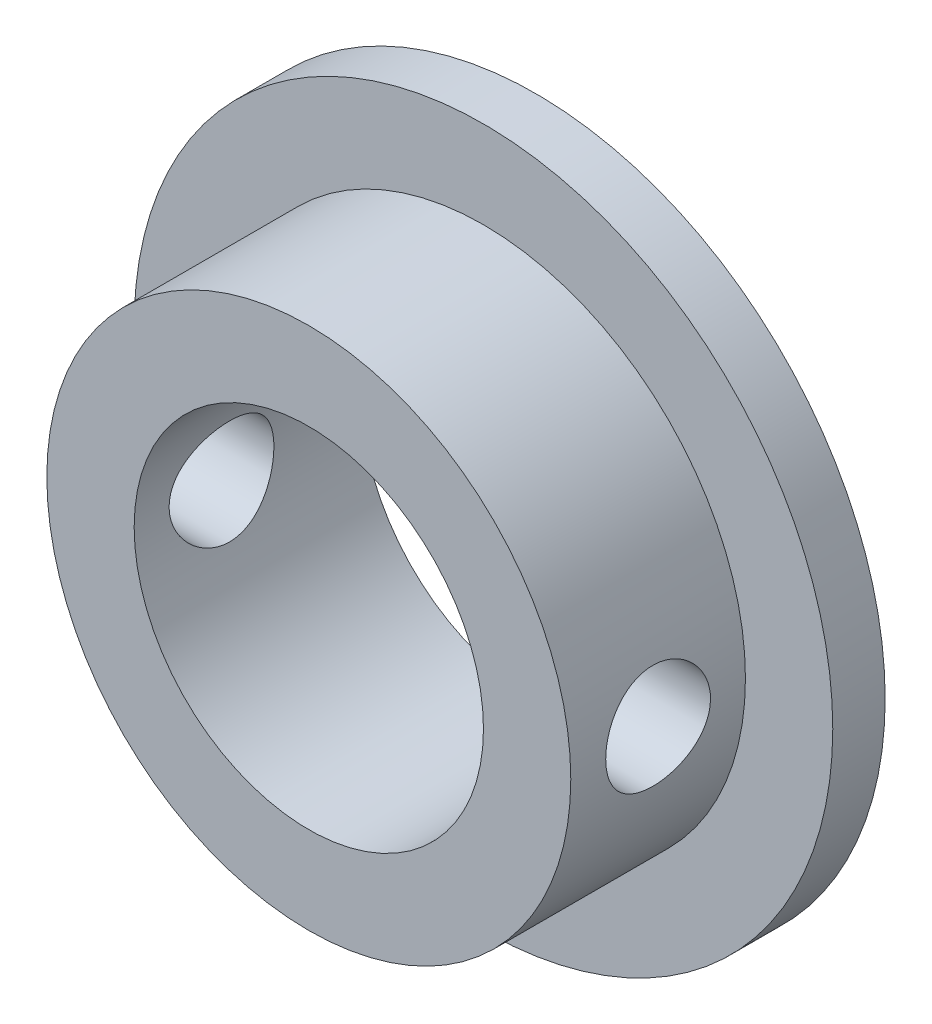
ISO-10303-21;
HEADER;
FILE_DESCRIPTION(('STEP AP214'),'2;1');
FILE_NAME('part.step','',(''),(''),'','','');
FILE_SCHEMA(('AUTOMOTIVE_DESIGN { 1 0 10303 214 1 1 1 1 }'));
ENDSEC;
DATA;
#1=APPLICATION_CONTEXT('core data for automotive mechanical design processes');
#2=APPLICATION_PROTOCOL_DEFINITION('international standard','automotive_design',2000,#1);
#3=PRODUCT_CONTEXT('',#1,'mechanical');
#4=PRODUCT('Part','Part','',(#3));
#5=PRODUCT_RELATED_PRODUCT_CATEGORY('part','',(#4));
#6=PRODUCT_DEFINITION_FORMATION('','',#4);
#7=PRODUCT_DEFINITION_CONTEXT('part definition',#1,'design');
#8=PRODUCT_DEFINITION('design','',#6,#7);
#9=PRODUCT_DEFINITION_SHAPE('','',#8);
#10=(LENGTH_UNIT() NAMED_UNIT(*) SI_UNIT(.MILLI.,.METRE.));
#11=(NAMED_UNIT(*) PLANE_ANGLE_UNIT() SI_UNIT($,.RADIAN.));
#12=(NAMED_UNIT(*) SI_UNIT($,.STERADIAN.) SOLID_ANGLE_UNIT());
#13=UNCERTAINTY_MEASURE_WITH_UNIT(LENGTH_MEASURE(1.E-05),#10,'distance_accuracy_value','');
#14=(GEOMETRIC_REPRESENTATION_CONTEXT(3) GLOBAL_UNCERTAINTY_ASSIGNED_CONTEXT((#13)) GLOBAL_UNIT_ASSIGNED_CONTEXT((#10,
#11,#12)) REPRESENTATION_CONTEXT('',''));
#15=CARTESIAN_POINT('',(0.,0.,0.));
#16=DIRECTION('',(0.,0.,1.));
#17=DIRECTION('',(1.,0.,0.));
#18=AXIS2_PLACEMENT_3D('',#15,#16,#17);
#19=CARTESIAN_POINT('',(0.,0.,1.5));
#20=DIRECTION('',(0.,0.,-1.));
#21=DIRECTION('',(-1.,0.,0.));
#22=AXIS2_PLACEMENT_3D('',#19,#20,#21);
#23=CYLINDRICAL_SURFACE('',#22,10.);
#24=CARTESIAN_POINT('',(0.,0.,1.5));
#25=DIRECTION('',(0.,0.,1.));
#26=DIRECTION('',(1.,0.,0.));
#27=AXIS2_PLACEMENT_3D('',#24,#25,#26);
#28=CIRCLE('',#27,10.);
#29=CARTESIAN_POINT('',(10.,0.,1.5));
#30=VERTEX_POINT('',#29);
#31=EDGE_CURVE('E52',#30,#30,#28,.T.);
#32=ORIENTED_EDGE('',*,*,#31,.F.);
#33=EDGE_LOOP('',(#32));
#34=FACE_BOUND('',#33,.T.);
#35=CARTESIAN_POINT('',(0.,0.,0.));
#36=DIRECTION('',(0.,0.,1.));
#37=DIRECTION('',(1.,0.,0.));
#38=AXIS2_PLACEMENT_3D('',#35,#36,#37);
#39=CIRCLE('',#38,10.);
#40=CARTESIAN_POINT('',(10.,0.,0.));
#41=VERTEX_POINT('',#40);
#42=EDGE_CURVE('E60',#41,#41,#39,.T.);
#43=ORIENTED_EDGE('',*,*,#42,.T.);
#44=EDGE_LOOP('',(#43));
#45=FACE_BOUND('',#44,.T.);
#46=ADVANCED_FACE('F39',(#34,#45),#23,.T.);
#47=CARTESIAN_POINT('',(0.,0.,1.5));
#48=DIRECTION('',(0.,0.,1.));
#49=DIRECTION('',(1.,0.,0.));
#50=AXIS2_PLACEMENT_3D('',#47,#48,#49);
#51=PLANE('',#50);
#52=CARTESIAN_POINT('',(0.,0.,1.5));
#53=DIRECTION('',(0.,0.,1.));
#54=DIRECTION('',(1.,0.,0.));
#55=AXIS2_PLACEMENT_3D('',#52,#53,#54);
#56=CIRCLE('',#55,7.5);
#57=CARTESIAN_POINT('',(7.5,0.,1.5));
#58=VERTEX_POINT('',#57);
#59=EDGE_CURVE('E10',#58,#58,#56,.T.);
#60=ORIENTED_EDGE('',*,*,#59,.F.);
#61=EDGE_LOOP('',(#60));
#62=FACE_BOUND('',#61,.T.);
#63=ORIENTED_EDGE('',*,*,#31,.T.);
#64=EDGE_LOOP('',(#63));
#65=FACE_BOUND('',#64,.T.);
#66=ADVANCED_FACE('F106',(#62,#65),#51,.T.);
#67=CARTESIAN_POINT('',(0.,0.,0.));
#68=DIRECTION('',(0.,0.,1.));
#69=DIRECTION('',(1.,0.,0.));
#70=AXIS2_PLACEMENT_3D('',#67,#68,#69);
#71=PLANE('',#70);
#72=CARTESIAN_POINT('',(0.,0.,0.));
#73=DIRECTION('',(0.,0.,1.));
#74=DIRECTION('',(1.,0.,0.));
#75=AXIS2_PLACEMENT_3D('',#72,#73,#74);
#76=CIRCLE('',#75,5.);
#77=CARTESIAN_POINT('',(5.,0.,0.));
#78=VERTEX_POINT('',#77);
#79=EDGE_CURVE('E208',#78,#78,#76,.T.);
#80=ORIENTED_EDGE('',*,*,#79,.T.);
#81=EDGE_LOOP('',(#80));
#82=FACE_BOUND('',#81,.T.);
#83=ORIENTED_EDGE('',*,*,#42,.F.);
#84=EDGE_LOOP('',(#83));
#85=FACE_BOUND('',#84,.T.);
#86=ADVANCED_FACE('F104',(#82,#85),#71,.F.);
#87=CARTESIAN_POINT('',(0.,0.,6.5));
#88=DIRECTION('',(0.,0.,-1.));
#89=DIRECTION('',(-1.,0.,0.));
#90=AXIS2_PLACEMENT_3D('',#87,#88,#89);
#91=CYLINDRICAL_SURFACE('',#90,7.5);
#92=CARTESIAN_POINT('',(-7.5,0.,5.5));
#93=CARTESIAN_POINT('',(-7.49999846371307,-0.0833653601889498,5.49999693325248));
#94=CARTESIAN_POINT('',(-7.49859577767346,-0.166769490302284,5.49302673554853));
#95=CARTESIAN_POINT('',(-7.49313548434847,-0.331220261533529,5.46535224982713));
#96=CARTESIAN_POINT('',(-7.48907576790279,-0.412264976312034,5.44463705079774));
#97=CARTESIAN_POINT('',(-7.4787547391743,-0.569595457894969,5.39013808956882));
#98=CARTESIAN_POINT('',(-7.47249553615077,-0.645885701899701,5.35636684473297));
#99=CARTESIAN_POINT('',(-7.45845597052971,-0.791711983296338,5.27675162873306));
#100=CARTESIAN_POINT('',(-7.4506756985356,-0.861248422613717,5.23090837658919));
#101=CARTESIAN_POINT('',(-7.43433247994955,-0.992540215972297,5.12779225856285));
#102=CARTESIAN_POINT('',(-7.42576118256521,-1.05419092673779,5.07038746691319));
#103=CARTESIAN_POINT('',(-7.40886270678882,-1.16705513491204,4.94606137541244));
#104=CARTESIAN_POINT('',(-7.40053554750636,-1.21826781715564,4.87913933299732));
#105=CARTESIAN_POINT('',(-7.38498662718923,-1.30924763002143,4.73692571048219));
#106=CARTESIAN_POINT('',(-7.37777561047419,-1.3489064082988,4.66156353430546));
#107=CARTESIAN_POINT('',(-7.36539402087627,-1.41495849987046,4.50507727149388));
#108=CARTESIAN_POINT('',(-7.36022324642942,-1.44135312365586,4.42395375498048));
#109=CARTESIAN_POINT('',(-7.35259207878307,-1.47978794982724,4.25937345413812));
#110=CARTESIAN_POINT('',(-7.35009705160781,-1.49201174693816,4.17596118378666));
#111=CARTESIAN_POINT('',(-7.34799562590941,-1.50232819158918,4.00823526795348));
#112=CARTESIAN_POINT('',(-7.34838893201761,-1.50042228407025,3.92392171551978));
#113=CARTESIAN_POINT('',(-7.35198826722277,-1.48268185965273,3.75812981796849));
#114=CARTESIAN_POINT('',(-7.35515179288145,-1.46705781036586,3.67662789155903));
#115=CARTESIAN_POINT('',(-7.36386819240002,-1.42265682693457,3.5174258850055));
#116=CARTESIAN_POINT('',(-7.36942118036668,-1.39387926465102,3.43972598662149));
#117=CARTESIAN_POINT('',(-7.38233427750612,-1.32378717551208,3.2897271074446));
#118=CARTESIAN_POINT('',(-7.38970634720557,-1.28238922684817,3.21746818064624));
#119=CARTESIAN_POINT('',(-7.40541928159593,-1.18829036185902,3.08084372504078));
#120=CARTESIAN_POINT('',(-7.41376025757549,-1.13558814653524,3.01647910472326));
#121=CARTESIAN_POINT('',(-7.43065531862193,-1.01924990184087,2.89625589631459));
#122=CARTESIAN_POINT('',(-7.43921053816357,-0.955434241818664,2.8405711482113));
#123=CARTESIAN_POINT('',(-7.45543273071613,-0.819277536093011,2.74066923054816));
#124=CARTESIAN_POINT('',(-7.4630996923346,-0.74693638106908,2.69645220805963));
#125=CARTESIAN_POINT('',(-7.47670035241331,-0.595589080318378,2.62070873616104));
#126=CARTESIAN_POINT('',(-7.48263133272408,-0.516572729377946,2.58920215953319));
#127=CARTESIAN_POINT('',(-7.49207113481787,-0.354223464672993,2.53995928894215));
#128=CARTESIAN_POINT('',(-7.49558025000797,-0.27089107510867,2.52222132688956));
#129=CARTESIAN_POINT('',(-7.49974007800302,-0.103769108440722,2.50126531930858));
#130=CARTESIAN_POINT('',(-7.50043761978705,-0.0200104924883604,2.4978093706896));
#131=CARTESIAN_POINT('',(-7.49902577895154,0.146887401289075,2.50487478841327));
#132=CARTESIAN_POINT('',(-7.49691655412169,0.230026713665694,2.51539536902889));
#133=CARTESIAN_POINT('',(-7.49015748012026,0.392558489919815,2.54991756031593));
#134=CARTESIAN_POINT('',(-7.4855306460631,0.471977922509858,2.57379710274685));
#135=CARTESIAN_POINT('',(-7.47425328091549,0.625685441249504,2.63422597398371));
#136=CARTESIAN_POINT('',(-7.4676025982134,0.699973142456313,2.67077625201525));
#137=CARTESIAN_POINT('',(-7.45289867299942,0.84231176052933,2.75602373597697));
#138=CARTESIAN_POINT('',(-7.44482925655578,0.910275190128285,2.80486417155842));
#139=CARTESIAN_POINT('',(-7.42822102244823,1.03712702867881,2.91311378681092));
#140=CARTESIAN_POINT('',(-7.41968215452582,1.09601446339615,2.9725240995998));
#141=CARTESIAN_POINT('',(-7.40293955335447,1.20396088616127,3.10131002783669));
#142=CARTESIAN_POINT('',(-7.39474290349956,1.25285655367299,3.17082361633201));
#143=CARTESIAN_POINT('',(-7.37976287694291,1.33827813007681,3.31721704203502));
#144=CARTESIAN_POINT('',(-7.37297944370014,1.37480453388436,3.39409658436033));
#145=CARTESIAN_POINT('',(-7.36165110876574,1.43422776237294,3.55265236922432));
#146=CARTESIAN_POINT('',(-7.3570946230828,1.45719524968658,3.63430126181548));
#147=CARTESIAN_POINT('',(-7.35071155188038,1.4890629774408,3.80040018023636));
#148=CARTESIAN_POINT('',(-7.34888461036667,1.49796505233767,3.88484983931402));
#149=CARTESIAN_POINT('',(-7.34818724447069,1.5013813663012,4.05251329681648));
#150=CARTESIAN_POINT('',(-7.34926378783951,1.49615368210635,4.13572172339052));
#151=CARTESIAN_POINT('',(-7.35413360226921,1.47202845615009,4.30004747485754));
#152=CARTESIAN_POINT('',(-7.35792685150754,1.45313102419395,4.38116481654221));
#153=CARTESIAN_POINT('',(-7.36777896328738,1.40231785274843,4.53884156686082));
#154=CARTESIAN_POINT('',(-7.37383231528246,1.37043376007602,4.61541154075363));
#155=CARTESIAN_POINT('',(-7.38752572461255,1.29458196690241,4.76215558110166));
#156=CARTESIAN_POINT('',(-7.39516591498341,1.25061325316232,4.83232911058771));
#157=CARTESIAN_POINT('',(-7.41133440784838,1.15095887217962,4.96557335822547));
#158=CARTESIAN_POINT('',(-7.41987559364549,1.09508683085277,5.02850314790139));
#159=CARTESIAN_POINT('',(-7.43679122807932,0.973596553519711,5.14417930829376));
#160=CARTESIAN_POINT('',(-7.44516563794777,0.907976080730002,5.19692333547591));
#161=CARTESIAN_POINT('',(-7.46090748581957,0.768026443632369,5.29125196591967));
#162=CARTESIAN_POINT('',(-7.46826346828869,0.693613326644752,5.33271400492004));
#163=CARTESIAN_POINT('',(-7.481026876275,0.538749541411099,5.40247918389489));
#164=CARTESIAN_POINT('',(-7.48643605707924,0.458304391294689,5.43079418429874));
#165=CARTESIAN_POINT('',(-7.49364558893056,0.314732233385669,5.46797792206707));
#166=CARTESIAN_POINT('',(-7.49601454737677,0.252422496020676,5.47996479056164));
#167=CARTESIAN_POINT('',(-7.49919231209839,0.1267492878151,5.49597686853755));
#168=CARTESIAN_POINT('',(-7.50000116809732,0.0633858506229284,5.50000233176465));
#169=CARTESIAN_POINT('',(-7.5,0.,5.5));
#170=B_SPLINE_CURVE_WITH_KNOTS('',3,(#92,#93,#94,#95,#96,#97,#98,#99,#100,#101,#102,#103,#104,
#105,#106,#107,#108,#109,#110,#111,#112,#113,#114,#115,#116,#117,#118,#119,#120,#121,#122,#123,
#124,#125,#126,#127,#128,#129,#130,#131,#132,#133,#134,#135,#136,#137,#138,#139,#140,#141,#142,
#143,#144,#145,#146,#147,#148,#149,#150,#151,#152,#153,#154,#155,#156,#157,#158,#159,#160,#161,
#162,#163,#164,#165,#166,#167,#168,#169),.UNSPECIFIED.,.T.,.F.,(4,2,2,2,2,2,2,2,2,2,2,2,2,2,2,2,
2,2,2,2,2,2,2,2,2,2,2,2,2,2,2,2,2,2,2,2,2,2,4),(0.,0.249864195991888,0.499926976036985,
0.749750602875512,0.999559353346295,1.25239900516828,1.50525839512105,1.76041792508884,
2.01555224047796,2.26734277655381,2.51910756421838,2.76707590509417,3.01505608880594,
3.26471235305389,3.51439732124506,3.76857378737026,4.0227535130973,4.27732912281036,
4.53187388547054,4.78216103514398,5.03243411486801,5.28045680926085,5.52849808824034,
5.77957599050038,6.03068082518895,6.28560942868839,6.540527830852,6.79410571549085,
7.04765052495622,7.29659583851552,7.54553915238913,7.79387941879665,8.042240513728,
8.29482114358715,8.54745981799396,8.80274245013456,9.05779433276278,9.24778162934841,
9.43776287056494),.UNSPECIFIED.);
#171=CARTESIAN_POINT('',(-7.5,0.,5.5));
#172=VERTEX_POINT('',#171);
#173=EDGE_CURVE('E87',#172,#172,#170,.T.);
#174=ORIENTED_EDGE('',*,*,#173,.T.);
#175=EDGE_LOOP('',(#174));
#176=FACE_BOUND('',#175,.T.);
#177=CARTESIAN_POINT('',(7.5,0.,2.5));
#178=CARTESIAN_POINT('',(7.49999846371307,-0.0833653601889498,2.50000306674752));
#179=CARTESIAN_POINT('',(7.49859577767346,-0.166769490302284,2.50697326445147));
#180=CARTESIAN_POINT('',(7.49313548434847,-0.331220261533529,2.53464775017287));
#181=CARTESIAN_POINT('',(7.48907576790279,-0.412264976312034,2.55536294920227));
#182=CARTESIAN_POINT('',(7.4787547391743,-0.569595457894969,2.60986191043118));
#183=CARTESIAN_POINT('',(7.47249553615077,-0.645885701899701,2.64363315526703));
#184=CARTESIAN_POINT('',(7.45845597052971,-0.791711983296338,2.72324837126694));
#185=CARTESIAN_POINT('',(7.4506756985356,-0.861248422613718,2.76909162341081));
#186=CARTESIAN_POINT('',(7.43433247994955,-0.992540215972297,2.87220774143715));
#187=CARTESIAN_POINT('',(7.42576118256521,-1.05419092673779,2.92961253308681));
#188=CARTESIAN_POINT('',(7.40886270678882,-1.16705513491204,3.05393862458756));
#189=CARTESIAN_POINT('',(7.40053554750636,-1.21826781715564,3.12086066700268));
#190=CARTESIAN_POINT('',(7.38498662718923,-1.30924763002143,3.26307428951781));
#191=CARTESIAN_POINT('',(7.37777561047419,-1.3489064082988,3.33843646569454));
#192=CARTESIAN_POINT('',(7.36539402087627,-1.41495849987046,3.49492272850612));
#193=CARTESIAN_POINT('',(7.36022324642942,-1.44135312365586,3.57604624501952));
#194=CARTESIAN_POINT('',(7.35259207878307,-1.47978794982724,3.74062654586188));
#195=CARTESIAN_POINT('',(7.35009705160781,-1.49201174693816,3.82403881621334));
#196=CARTESIAN_POINT('',(7.34799562590941,-1.50232819158918,3.99176473204652));
#197=CARTESIAN_POINT('',(7.34838893201761,-1.50042228407025,4.07607828448022));
#198=CARTESIAN_POINT('',(7.35198826722277,-1.48268185965273,4.24187018203151));
#199=CARTESIAN_POINT('',(7.35515179288145,-1.46705781036586,4.32337210844097));
#200=CARTESIAN_POINT('',(7.36386819240002,-1.42265682693457,4.48257411499451));
#201=CARTESIAN_POINT('',(7.36942118036668,-1.39387926465102,4.56027401337851));
#202=CARTESIAN_POINT('',(7.38233427750612,-1.32378717551208,4.7102728925554));
#203=CARTESIAN_POINT('',(7.38970634720557,-1.28238922684817,4.78253181935376));
#204=CARTESIAN_POINT('',(7.40541928159593,-1.18829036185902,4.91915627495922));
#205=CARTESIAN_POINT('',(7.41376025757549,-1.13558814653524,4.98352089527674));
#206=CARTESIAN_POINT('',(7.43065531862193,-1.01924990184087,5.1037441036854));
#207=CARTESIAN_POINT('',(7.43921053816357,-0.955434241818665,5.1594288517887));
#208=CARTESIAN_POINT('',(7.45543273071613,-0.819277536093012,5.25933076945184));
#209=CARTESIAN_POINT('',(7.4630996923346,-0.746936381069081,5.30354779194037));
#210=CARTESIAN_POINT('',(7.47670035241331,-0.595589080318378,5.37929126383896));
#211=CARTESIAN_POINT('',(7.48263133272408,-0.516572729377947,5.41079784046681));
#212=CARTESIAN_POINT('',(7.49207113481787,-0.354223464672994,5.46004071105785));
#213=CARTESIAN_POINT('',(7.49558025000797,-0.270891075108671,5.47777867311044));
#214=CARTESIAN_POINT('',(7.49974007800302,-0.103769108440722,5.49873468069142));
#215=CARTESIAN_POINT('',(7.50043761978705,-0.0200104924883603,5.5021906293104));
#216=CARTESIAN_POINT('',(7.49902577895154,0.146887401289075,5.49512521158673));
#217=CARTESIAN_POINT('',(7.49691655412169,0.230026713665694,5.48460463097111));
#218=CARTESIAN_POINT('',(7.49015748012026,0.392558489919815,5.45008243968407));
#219=CARTESIAN_POINT('',(7.4855306460631,0.471977922509858,5.42620289725314));
#220=CARTESIAN_POINT('',(7.47425328091549,0.625685441249504,5.36577402601629));
#221=CARTESIAN_POINT('',(7.4676025982134,0.699973142456313,5.32922374798475));
#222=CARTESIAN_POINT('',(7.45289867299942,0.84231176052933,5.24397626402303));
#223=CARTESIAN_POINT('',(7.44482925655578,0.910275190128285,5.19513582844158));
#224=CARTESIAN_POINT('',(7.42822102244823,1.03712702867881,5.08688621318908));
#225=CARTESIAN_POINT('',(7.41968215452582,1.09601446339615,5.0274759004002));
#226=CARTESIAN_POINT('',(7.40293955335447,1.20396088616127,4.89868997216331));
#227=CARTESIAN_POINT('',(7.39474290349956,1.25285655367299,4.82917638366799));
#228=CARTESIAN_POINT('',(7.37976287694291,1.33827813007681,4.68278295796498));
#229=CARTESIAN_POINT('',(7.37297944370014,1.37480453388436,4.60590341563967));
#230=CARTESIAN_POINT('',(7.36165110876574,1.43422776237294,4.44734763077568));
#231=CARTESIAN_POINT('',(7.3570946230828,1.45719524968658,4.36569873818452));
#232=CARTESIAN_POINT('',(7.35071155188038,1.4890629774408,4.19959981976364));
#233=CARTESIAN_POINT('',(7.34888461036667,1.49796505233767,4.11515016068598));
#234=CARTESIAN_POINT('',(7.34818724447069,1.5013813663012,3.94748670318352));
#235=CARTESIAN_POINT('',(7.34926378783951,1.49615368210635,3.86427827660948));
#236=CARTESIAN_POINT('',(7.35413360226921,1.47202845615009,3.69995252514246));
#237=CARTESIAN_POINT('',(7.35792685150754,1.45313102419395,3.61883518345779));
#238=CARTESIAN_POINT('',(7.36777896328738,1.40231785274843,3.46115843313918));
#239=CARTESIAN_POINT('',(7.37383231528246,1.37043376007602,3.38458845924638));
#240=CARTESIAN_POINT('',(7.38752572461255,1.29458196690241,3.23784441889834));
#241=CARTESIAN_POINT('',(7.39516591498341,1.25061325316232,3.16767088941229));
#242=CARTESIAN_POINT('',(7.41133440784838,1.15095887217962,3.03442664177453));
#243=CARTESIAN_POINT('',(7.41987559364549,1.09508683085277,2.97149685209861));
#244=CARTESIAN_POINT('',(7.43679122807932,0.973596553519712,2.85582069170624));
#245=CARTESIAN_POINT('',(7.44516563794777,0.907976080730003,2.80307666452409));
#246=CARTESIAN_POINT('',(7.46090748581957,0.76802644363237,2.70874803408033));
#247=CARTESIAN_POINT('',(7.46826346828869,0.693613326644753,2.66728599507996));
#248=CARTESIAN_POINT('',(7.481026876275,0.538749541411099,2.59752081610511));
#249=CARTESIAN_POINT('',(7.48643605707924,0.458304391294689,2.56920581570126));
#250=CARTESIAN_POINT('',(7.49364558893056,0.314732233385669,2.53202207793293));
#251=CARTESIAN_POINT('',(7.49601454737677,0.252422496020677,2.52003520943836));
#252=CARTESIAN_POINT('',(7.49919231209839,0.1267492878151,2.50402313146245));
#253=CARTESIAN_POINT('',(7.50000116809732,0.0633858506229285,2.49999766823535));
#254=CARTESIAN_POINT('',(7.5,0.,2.5));
#255=B_SPLINE_CURVE_WITH_KNOTS('',3,(#177,#178,#179,#180,#181,#182,#183,#184,#185,#186,#187,
#188,#189,#190,#191,#192,#193,#194,#195,#196,#197,#198,#199,#200,#201,#202,#203,#204,#205,#206,
#207,#208,#209,#210,#211,#212,#213,#214,#215,#216,#217,#218,#219,#220,#221,#222,#223,#224,#225,
#226,#227,#228,#229,#230,#231,#232,#233,#234,#235,#236,#237,#238,#239,#240,#241,#242,#243,#244,
#245,#246,#247,#248,#249,#250,#251,#252,#253,#254),.UNSPECIFIED.,.T.,.F.,(4,2,2,2,2,2,2,2,2,2,2,
2,2,2,2,2,2,2,2,2,2,2,2,2,2,2,2,2,2,2,2,2,2,2,2,2,2,2,4),(0.,0.249864195991888,
0.499926976036985,0.749750602875513,0.999559353346295,1.25239900516828,1.50525839512105,
1.76041792508884,2.01555224047796,2.26734277655381,2.51910756421838,2.76707590509418,
3.01505608880595,3.26471235305389,3.51439732124506,3.76857378737026,4.0227535130973,
4.27732912281036,4.53187388547054,4.78216103514398,5.03243411486801,5.28045680926085,
5.52849808824034,5.77957599050038,6.03068082518895,6.28560942868839,6.540527830852,
6.79410571549085,7.04765052495622,7.29659583851552,7.54553915238913,7.79387941879665,
8.042240513728,8.29482114358715,8.54745981799396,8.80274245013456,9.05779433276278,
9.24778162934841,9.43776287056495),.UNSPECIFIED.);
#256=CARTESIAN_POINT('',(7.5,0.,2.5));
#257=VERTEX_POINT('',#256);
#258=EDGE_CURVE('E94',#257,#257,#255,.T.);
#259=ORIENTED_EDGE('',*,*,#258,.T.);
#260=EDGE_LOOP('',(#259));
#261=FACE_BOUND('',#260,.T.);
#262=CARTESIAN_POINT('',(0.,0.,6.5));
#263=DIRECTION('',(0.,0.,1.));
#264=DIRECTION('',(1.,0.,0.));
#265=AXIS2_PLACEMENT_3D('',#262,#263,#264);
#266=CIRCLE('',#265,7.5);
#267=CARTESIAN_POINT('',(7.5,0.,6.5));
#268=VERTEX_POINT('',#267);
#269=EDGE_CURVE('E63',#268,#268,#266,.T.);
#270=ORIENTED_EDGE('',*,*,#269,.F.);
#271=EDGE_LOOP('',(#270));
#272=FACE_BOUND('',#271,.T.);
#273=ORIENTED_EDGE('',*,*,#59,.T.);
#274=EDGE_LOOP('',(#273));
#275=FACE_BOUND('',#274,.T.);
#276=ADVANCED_FACE('F99',(#176,#261,#272,#275),#91,.T.);
#277=CARTESIAN_POINT('',(0.,0.,6.5));
#278=DIRECTION('',(0.,0.,1.));
#279=DIRECTION('',(1.,0.,0.));
#280=AXIS2_PLACEMENT_3D('',#277,#278,#279);
#281=PLANE('',#280);
#282=CARTESIAN_POINT('',(0.,0.,6.5));
#283=DIRECTION('',(0.,0.,1.));
#284=DIRECTION('',(1.,0.,0.));
#285=AXIS2_PLACEMENT_3D('',#282,#283,#284);
#286=CIRCLE('',#285,5.);
#287=CARTESIAN_POINT('',(5.,0.,6.5));
#288=VERTEX_POINT('',#287);
#289=EDGE_CURVE('E211',#288,#288,#286,.T.);
#290=ORIENTED_EDGE('',*,*,#289,.F.);
#291=EDGE_LOOP('',(#290));
#292=FACE_BOUND('',#291,.T.);
#293=ORIENTED_EDGE('',*,*,#269,.T.);
#294=EDGE_LOOP('',(#293));
#295=FACE_BOUND('',#294,.T.);
#296=ADVANCED_FACE('F103',(#292,#295),#281,.T.);
#297=CARTESIAN_POINT('',(0.,0.,0.));
#298=DIRECTION('',(0.,0.,1.));
#299=DIRECTION('',(1.,0.,0.));
#300=AXIS2_PLACEMENT_3D('',#297,#298,#299);
#301=CYLINDRICAL_SURFACE('',#300,5.);
#302=CARTESIAN_POINT('',(5.,0.,2.5));
#303=CARTESIAN_POINT('',(4.9999992925055,0.0822886127532999,2.50000099748489));
#304=CARTESIAN_POINT('',(4.99794915693954,0.164587318351529,2.50679386362397));
#305=CARTESIAN_POINT('',(4.98997105593691,0.326788125304881,2.5337213542221));
#306=CARTESIAN_POINT('',(4.98404193389692,0.40668950441142,2.55385995802334));
#307=CARTESIAN_POINT('',(4.96895552501836,0.561732707754527,2.60674601691026));
#308=CARTESIAN_POINT('',(4.95980300250425,0.636881364395373,2.63947486961894));
#309=CARTESIAN_POINT('',(4.93922109237645,0.780624181053131,2.71653609305584));
#310=CARTESIAN_POINT('',(4.92779140192067,0.84921746746967,2.76087000739542));
#311=CARTESIAN_POINT('',(4.90350737192774,0.979871797183745,2.86122400747267));
#312=CARTESIAN_POINT('',(4.89062383657036,1.04171807124434,2.91751662588591));
#313=CARTESIAN_POINT('',(4.86505834210442,1.15524920923324,3.03960922991018));
#314=CARTESIAN_POINT('',(4.85237641724501,1.20693236327441,3.10541081212496));
#315=CARTESIAN_POINT('',(4.82834113993772,1.29980037723708,3.24647075303761));
#316=CARTESIAN_POINT('',(4.81702406663875,1.34072309022214,3.32190846099074));
#317=CARTESIAN_POINT('',(4.79743620394031,1.4092139477476,3.47898925423029));
#318=CARTESIAN_POINT('',(4.78916468313311,1.43678529919973,3.56063084392797));
#319=CARTESIAN_POINT('',(4.77690870838434,1.47701633682652,3.72539026613046));
#320=CARTESIAN_POINT('',(4.77281069324533,1.49007196234678,3.80840274386394));
#321=CARTESIAN_POINT('',(4.76902789749767,1.50213730614672,3.97553315621676));
#322=CARTESIAN_POINT('',(4.76934204760571,1.50115042761078,4.05965081805909));
#323=CARTESIAN_POINT('',(4.77424744067778,1.48546977199812,4.22338390860848));
#324=CARTESIAN_POINT('',(4.77868388599141,1.47127205262685,4.30305225036224));
#325=CARTESIAN_POINT('',(4.79108356228624,1.43037420427056,4.45881978627346));
#326=CARTESIAN_POINT('',(4.7990471413235,1.40367284141641,4.53491862737433));
#327=CARTESIAN_POINT('',(4.81772733074973,1.33816026653682,4.68260034966074));
#328=CARTESIAN_POINT('',(4.82848016115952,1.29918816934643,4.75410708395526));
#329=CARTESIAN_POINT('',(4.85150987000064,1.21035222588684,4.88973202201019));
#330=CARTESIAN_POINT('',(4.86378711746991,1.16048574002589,4.95384842941378));
#331=CARTESIAN_POINT('',(4.88911011297937,1.04881290765547,5.07568619076202));
#332=CARTESIAN_POINT('',(4.90216654310498,0.986594907466976,5.13302866402967));
#333=CARTESIAN_POINT('',(4.92712244063259,0.853263259313971,5.23655398406425));
#334=CARTESIAN_POINT('',(4.9390218351841,0.782149051860892,5.28273612841443));
#335=CARTESIAN_POINT('',(4.9604316006947,0.632355038342807,5.36285992246473));
#336=CARTESIAN_POINT('',(4.96992543668314,0.553627749747954,5.39671751624986));
#337=CARTESIAN_POINT('',(4.98533521832222,0.391245415603523,5.45059959009963));
#338=CARTESIAN_POINT('',(4.99125216186999,0.307591751589585,5.47062792853249));
#339=CARTESIAN_POINT('',(4.99868364643538,0.140952242668336,5.49565217789939));
#340=CARTESIAN_POINT('',(5.0003485041779,0.0580500976011909,5.50116158580161));
#341=CARTESIAN_POINT('',(4.9995292324176,-0.107499605823379,5.49843084428792));
#342=CARTESIAN_POINT('',(4.99704565677756,-0.190147196690777,5.49019253034856));
#343=CARTESIAN_POINT('',(4.98830696987163,-0.350903605309693,5.46061538888851));
#344=CARTESIAN_POINT('',(4.98213829799417,-0.429072772614165,5.43957661241913));
#345=CARTESIAN_POINT('',(4.96674347841533,-0.580754638954518,5.3853567672218));
#346=CARTESIAN_POINT('',(4.95751696321085,-0.65426677702558,5.35217423896214));
#347=CARTESIAN_POINT('',(4.93669654351325,-0.796437189461048,5.27374683451887));
#348=CARTESIAN_POINT('',(4.92505280829675,-0.864943826199666,5.22824065905203));
#349=CARTESIAN_POINT('',(4.90073468764318,-0.993523307980143,5.12677524594719));
#350=CARTESIAN_POINT('',(4.8880600443108,-1.05359403235593,5.07081338811233));
#351=CARTESIAN_POINT('',(4.86253171869138,-1.16585744551027,4.94761269163066));
#352=CARTESIAN_POINT('',(4.84968825033268,-1.21768481231503,4.88003812422826));
#353=CARTESIAN_POINT('',(4.82576515238464,-1.30928995072153,4.73687206098647));
#354=CARTESIAN_POINT('',(4.81468547654651,-1.34906803829472,4.66128077544179));
#355=CARTESIAN_POINT('',(4.79567189615055,-1.41517347127168,4.50446750874531));
#356=CARTESIAN_POINT('',(4.78772337843827,-1.44156346937049,4.42327381346341));
#357=CARTESIAN_POINT('',(4.77591594362794,-1.48021730815114,4.25731203106852));
#358=CARTESIAN_POINT('',(4.772055625083,-1.49248598978779,4.17254517921233));
#359=CARTESIAN_POINT('',(4.76899972496087,-1.50221984485059,4.00563848162377));
#360=CARTESIAN_POINT('',(4.76961647442754,-1.5002805530849,3.92353634898242));
#361=CARTESIAN_POINT('',(4.77499401288294,-1.48307505444813,3.7608858966272));
#362=CARTESIAN_POINT('',(4.77975463592551,-1.46780938124716,3.68033751482365));
#363=CARTESIAN_POINT('',(4.79275763670386,-1.42476888804136,3.52405460085715));
#364=CARTESIAN_POINT('',(4.80095604545965,-1.39715175507068,3.44827271263831));
#365=CARTESIAN_POINT('',(4.81990278909136,-1.33031507121129,3.30235756118228));
#366=CARTESIAN_POINT('',(4.83065161194312,-1.29109329962876,3.23222538235924));
#367=CARTESIAN_POINT('',(4.85397676425833,-1.20048763805072,3.09683688347289));
#368=CARTESIAN_POINT('',(4.86660540163798,-1.14871276092994,3.03185123873959));
#369=CARTESIAN_POINT('',(4.89201320450026,-1.03517434629782,2.91129750169214));
#370=CARTESIAN_POINT('',(4.90479240823905,-0.973408217134501,2.85573186053224));
#371=CARTESIAN_POINT('',(4.92950936570649,-0.839465762183248,2.75397658770497));
#372=CARTESIAN_POINT('',(4.94141159765674,-0.767037885790608,2.70810855314451));
#373=CARTESIAN_POINT('',(4.96260680455813,-0.61514137398353,2.62926483009598));
#374=CARTESIAN_POINT('',(4.97190099931067,-0.535676052998955,2.59628311172549));
#375=CARTESIAN_POINT('',(4.98602174969301,-0.380757712655281,2.54710472434725));
#376=CARTESIAN_POINT('',(4.99122027381068,-0.305786961954234,2.52948832711675));
#377=CARTESIAN_POINT('',(4.99820944494492,-0.153880195230779,2.50593647475842));
#378=CARTESIAN_POINT('',(5.0000006615474,-0.0769445098581395,2.49999906729518));
#379=CARTESIAN_POINT('',(5.,0.,2.5));
#380=B_SPLINE_CURVE_WITH_KNOTS('',3,(#302,#303,#304,#305,#306,#307,#308,#309,#310,#311,#312,
#313,#314,#315,#316,#317,#318,#319,#320,#321,#322,#323,#324,#325,#326,#327,#328,#329,#330,#331,
#332,#333,#334,#335,#336,#337,#338,#339,#340,#341,#342,#343,#344,#345,#346,#347,#348,#349,#350,
#351,#352,#353,#354,#355,#356,#357,#358,#359,#360,#361,#362,#363,#364,#365,#366,#367,#368,#369,
#370,#371,#372,#373,#374,#375,#376,#377,#378,#379),.UNSPECIFIED.,.T.,.F.,(4,2,2,2,2,2,2,2,2,2,2,
2,2,2,2,2,2,2,2,2,2,2,2,2,2,2,2,2,2,2,2,2,2,2,2,2,2,2,4),(0.,0.246583203612611,
0.493239964845999,0.739533676300874,0.985860164412702,1.23855602948191,1.49129437288633,
1.74971481004109,2.00807314543224,2.25919689356599,2.51025978319089,2.75226016697676,
2.99428443658001,3.23962426447119,3.48502360158555,3.74067104048166,3.99633456531071,
4.25371046881689,4.51101453528808,4.75908809438545,5.00712853550327,5.24956746682327,
5.49203554593728,5.74011305702908,5.98825282000191,6.24540400322818,6.5025484425268,
6.75847814951252,7.01432009460283,7.25950155466943,7.504673196616,7.74680040402721,
7.98897397553107,8.2399692567993,8.49102974897502,8.74942996156671,9.00770911595235,
9.23831691930459,9.46888616948874),.UNSPECIFIED.);
#381=CARTESIAN_POINT('',(5.,0.,2.5));
#382=VERTEX_POINT('',#381);
#383=EDGE_CURVE('E42',#382,#382,#380,.T.);
#384=ORIENTED_EDGE('',*,*,#383,.T.);
#385=EDGE_LOOP('',(#384));
#386=FACE_BOUND('',#385,.T.);
#387=CARTESIAN_POINT('',(-5.,0.,2.5));
#388=CARTESIAN_POINT('',(-4.9999992925055,-0.0822886127532982,2.50000099748489));
#389=CARTESIAN_POINT('',(-4.99794915693954,-0.164587318351528,2.50679386362397));
#390=CARTESIAN_POINT('',(-4.98997105593691,-0.326788125304879,2.5337213542221));
#391=CARTESIAN_POINT('',(-4.98404193389692,-0.406689504411418,2.55385995802334));
#392=CARTESIAN_POINT('',(-4.96895552501836,-0.561732707754525,2.60674601691026));
#393=CARTESIAN_POINT('',(-4.95980300250425,-0.636881364395371,2.63947486961894));
#394=CARTESIAN_POINT('',(-4.93922109237645,-0.78062418105313,2.71653609305584));
#395=CARTESIAN_POINT('',(-4.92779140192067,-0.849217467469668,2.76087000739542));
#396=CARTESIAN_POINT('',(-4.90350737192774,-0.979871797183743,2.86122400747267));
#397=CARTESIAN_POINT('',(-4.89062383657036,-1.04171807124434,2.91751662588591));
#398=CARTESIAN_POINT('',(-4.86505834210442,-1.15524920923324,3.03960922991018));
#399=CARTESIAN_POINT('',(-4.85237641724501,-1.20693236327441,3.10541081212496));
#400=CARTESIAN_POINT('',(-4.82834113993772,-1.29980037723707,3.24647075303761));
#401=CARTESIAN_POINT('',(-4.81702406663875,-1.34072309022213,3.32190846099074));
#402=CARTESIAN_POINT('',(-4.79743620394031,-1.4092139477476,3.47898925423029));
#403=CARTESIAN_POINT('',(-4.78916468313311,-1.43678529919973,3.56063084392798));
#404=CARTESIAN_POINT('',(-4.77690870838434,-1.47701633682651,3.72539026613046));
#405=CARTESIAN_POINT('',(-4.77281069324533,-1.49007196234677,3.80840274386394));
#406=CARTESIAN_POINT('',(-4.76902789749767,-1.50213730614672,3.97553315621677));
#407=CARTESIAN_POINT('',(-4.76934204760571,-1.50115042761078,4.05965081805909));
#408=CARTESIAN_POINT('',(-4.77424744067778,-1.48546977199811,4.22338390860848));
#409=CARTESIAN_POINT('',(-4.77868388599141,-1.47127205262685,4.30305225036224));
#410=CARTESIAN_POINT('',(-4.79108356228624,-1.43037420427056,4.45881978627346));
#411=CARTESIAN_POINT('',(-4.79904714132351,-1.40367284141641,4.53491862737433));
#412=CARTESIAN_POINT('',(-4.81772733074973,-1.33816026653681,4.68260034966074));
#413=CARTESIAN_POINT('',(-4.82848016115952,-1.29918816934642,4.75410708395526));
#414=CARTESIAN_POINT('',(-4.85150987000065,-1.21035222588683,4.88973202201019));
#415=CARTESIAN_POINT('',(-4.86378711746991,-1.16048574002588,4.95384842941378));
#416=CARTESIAN_POINT('',(-4.88911011297937,-1.04881290765546,5.07568619076202));
#417=CARTESIAN_POINT('',(-4.90216654310498,-0.98659490746697,5.13302866402967));
#418=CARTESIAN_POINT('',(-4.92712244063259,-0.853263259313965,5.23655398406425));
#419=CARTESIAN_POINT('',(-4.9390218351841,-0.782149051860886,5.28273612841443));
#420=CARTESIAN_POINT('',(-4.9604316006947,-0.632355038342801,5.36285992246473));
#421=CARTESIAN_POINT('',(-4.96992543668314,-0.553627749747948,5.39671751624986));
#422=CARTESIAN_POINT('',(-4.98533521832222,-0.391245415603517,5.45059959009963));
#423=CARTESIAN_POINT('',(-4.99125216186999,-0.30759175158958,5.47062792853249));
#424=CARTESIAN_POINT('',(-4.99868364643538,-0.14095224266833,5.4956521778994));
#425=CARTESIAN_POINT('',(-5.0003485041779,-0.0580500976011851,5.50116158580161));
#426=CARTESIAN_POINT('',(-4.9995292324176,0.107499605823385,5.49843084428792));
#427=CARTESIAN_POINT('',(-4.99704565677756,0.190147196690782,5.49019253034856));
#428=CARTESIAN_POINT('',(-4.98830696987163,0.350903605309699,5.4606153888885));
#429=CARTESIAN_POINT('',(-4.98213829799417,0.429072772614172,5.43957661241913));
#430=CARTESIAN_POINT('',(-4.96674347841533,0.580754638954524,5.3853567672218));
#431=CARTESIAN_POINT('',(-4.95751696321085,0.654266777025586,5.35217423896214));
#432=CARTESIAN_POINT('',(-4.93669654351325,0.796437189461054,5.27374683451887));
#433=CARTESIAN_POINT('',(-4.92505280829675,0.864943826199671,5.22824065905203));
#434=CARTESIAN_POINT('',(-4.90073468764317,0.993523307980149,5.12677524594719));
#435=CARTESIAN_POINT('',(-4.8880600443108,1.05359403235594,5.07081338811233));
#436=CARTESIAN_POINT('',(-4.86253171869138,1.16585744551027,4.94761269163065));
#437=CARTESIAN_POINT('',(-4.84968825033268,1.21768481231504,4.88003812422826));
#438=CARTESIAN_POINT('',(-4.82576515238463,1.30928995072154,4.73687206098647));
#439=CARTESIAN_POINT('',(-4.81468547654651,1.34906803829472,4.66128077544179));
#440=CARTESIAN_POINT('',(-4.79567189615055,1.41517347127169,4.50446750874531));
#441=CARTESIAN_POINT('',(-4.78772337843827,1.4415634693705,4.42327381346341));
#442=CARTESIAN_POINT('',(-4.77591594362794,1.48021730815114,4.25731203106852));
#443=CARTESIAN_POINT('',(-4.772055625083,1.49248598978779,4.17254517921233));
#444=CARTESIAN_POINT('',(-4.76899972496087,1.50221984485059,4.00563848162377));
#445=CARTESIAN_POINT('',(-4.76961647442754,1.5002805530849,3.92353634898241));
#446=CARTESIAN_POINT('',(-4.77499401288294,1.48307505444814,3.7608858966272));
#447=CARTESIAN_POINT('',(-4.77975463592551,1.46780938124716,3.68033751482365));
#448=CARTESIAN_POINT('',(-4.79275763670385,1.42476888804136,3.52405460085715));
#449=CARTESIAN_POINT('',(-4.80095604545965,1.39715175507069,3.44827271263831));
#450=CARTESIAN_POINT('',(-4.81990278909136,1.33031507121129,3.30235756118228));
#451=CARTESIAN_POINT('',(-4.83065161194312,1.29109329962876,3.23222538235924));
#452=CARTESIAN_POINT('',(-4.85397676425833,1.20048763805072,3.09683688347289));
#453=CARTESIAN_POINT('',(-4.86660540163797,1.14871276092994,3.03185123873959));
#454=CARTESIAN_POINT('',(-4.89201320450026,1.03517434629782,2.91129750169214));
#455=CARTESIAN_POINT('',(-4.90479240823905,0.973408217134503,2.85573186053224));
#456=CARTESIAN_POINT('',(-4.92950936570649,0.83946576218325,2.75397658770497));
#457=CARTESIAN_POINT('',(-4.94141159765674,0.767037885790609,2.70810855314451));
#458=CARTESIAN_POINT('',(-4.96260680455813,0.615141373983531,2.62926483009598));
#459=CARTESIAN_POINT('',(-4.97190099931067,0.535676052998956,2.59628311172549));
#460=CARTESIAN_POINT('',(-4.98602174969301,0.380757712655283,2.54710472434725));
#461=CARTESIAN_POINT('',(-4.99122027381068,0.305786961954236,2.52948832711675));
#462=CARTESIAN_POINT('',(-4.99820944494492,0.153880195230781,2.50593647475842));
#463=CARTESIAN_POINT('',(-5.0000006615474,0.0769445098581413,2.49999906729518));
#464=CARTESIAN_POINT('',(-5.,0.,2.5));
#465=B_SPLINE_CURVE_WITH_KNOTS('',3,(#387,#388,#389,#390,#391,#392,#393,#394,#395,#396,#397,
#398,#399,#400,#401,#402,#403,#404,#405,#406,#407,#408,#409,#410,#411,#412,#413,#414,#415,#416,
#417,#418,#419,#420,#421,#422,#423,#424,#425,#426,#427,#428,#429,#430,#431,#432,#433,#434,#435,
#436,#437,#438,#439,#440,#441,#442,#443,#444,#445,#446,#447,#448,#449,#450,#451,#452,#453,#454,
#455,#456,#457,#458,#459,#460,#461,#462,#463,#464),.UNSPECIFIED.,.T.,.F.,(4,2,2,2,2,2,2,2,2,2,2,
2,2,2,2,2,2,2,2,2,2,2,2,2,2,2,2,2,2,2,2,2,2,2,2,2,2,2,4),(0.,0.246583203612611,0.493239964846,
0.739533676300874,0.985860164412702,1.23855602948191,1.49129437288633,1.74971481004109,
2.00807314543224,2.25919689356599,2.51025978319089,2.75226016697676,2.99428443658001,
3.23962426447119,3.48502360158555,3.74067104048167,3.99633456531072,4.25371046881689,
4.51101453528808,4.75908809438545,5.00712853550327,5.24956746682327,5.49203554593728,
5.74011305702908,5.98825282000191,6.24540400322818,6.5025484425268,6.75847814951252,
7.01432009460283,7.25950155466943,7.504673196616,7.74680040402721,7.98897397553107,
8.23996925679931,8.49102974897502,8.74942996156671,9.00770911595235,9.23831691930459,
9.46888616948874),.UNSPECIFIED.);
#466=CARTESIAN_POINT('',(-5.,0.,2.5));
#467=VERTEX_POINT('',#466);
#468=EDGE_CURVE('E68',#467,#467,#465,.T.);
#469=ORIENTED_EDGE('',*,*,#468,.T.);
#470=EDGE_LOOP('',(#469));
#471=FACE_BOUND('',#470,.T.);
#472=ORIENTED_EDGE('',*,*,#79,.F.);
#473=EDGE_LOOP('',(#472));
#474=FACE_BOUND('',#473,.T.);
#475=ORIENTED_EDGE('',*,*,#289,.T.);
#476=EDGE_LOOP('',(#475));
#477=FACE_BOUND('',#476,.T.);
#478=ADVANCED_FACE('F74',(#386,#471,#474,#477),#301,.F.);
#479=CARTESIAN_POINT('',(-10.,0.,4.));
#480=DIRECTION('',(1.,0.,0.));
#481=DIRECTION('',(0.,0.,-1.));
#482=AXIS2_PLACEMENT_3D('',#479,#480,#481);
#483=CYLINDRICAL_SURFACE('',#482,1.5);
#484=ORIENTED_EDGE('',*,*,#468,.F.);
#485=EDGE_LOOP('',(#484));
#486=FACE_BOUND('',#485,.T.);
#487=ORIENTED_EDGE('',*,*,#173,.F.);
#488=EDGE_LOOP('',(#487));
#489=FACE_BOUND('',#488,.T.);
#490=ADVANCED_FACE('F80',(#486,#489),#483,.F.);
#491=ORIENTED_EDGE('',*,*,#383,.F.);
#492=EDGE_LOOP('',(#491));
#493=FACE_BOUND('',#492,.T.);
#494=ORIENTED_EDGE('',*,*,#258,.F.);
#495=EDGE_LOOP('',(#494));
#496=FACE_BOUND('',#495,.T.);
#497=ADVANCED_FACE('F77',(#493,#496),#483,.F.);
#498=CLOSED_SHELL('',(#46,#66,#86,#276,#296,#478,#490,#497));
#499=MANIFOLD_SOLID_BREP('B2',#498);
#500=ADVANCED_BREP_SHAPE_REPRESENTATION('',(#18,#499),#14);
#501=SHAPE_DEFINITION_REPRESENTATION(#9,#500);
ENDSEC;
END-ISO-10303-21;
